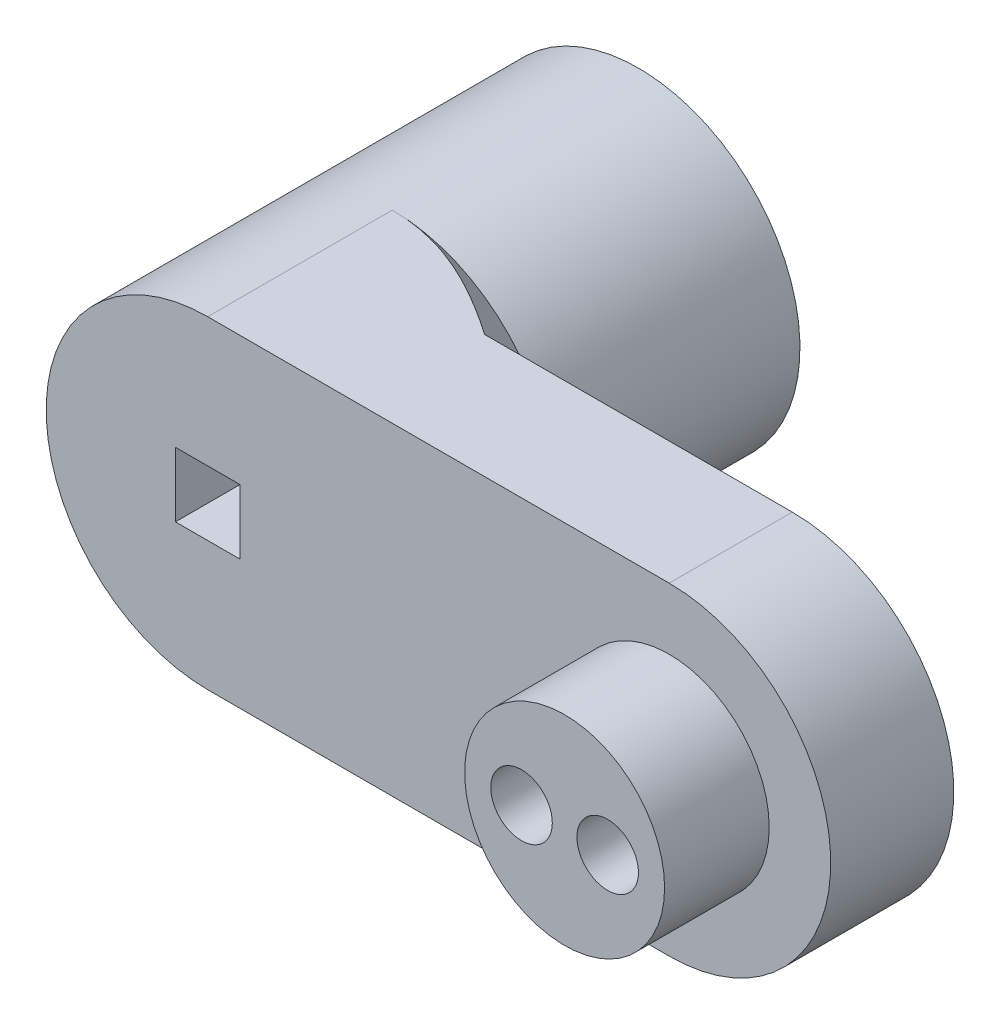
ISO-10303-21;
HEADER;
FILE_DESCRIPTION(('STEP AP214'),'2;1');
FILE_NAME('part.step','',(''),(''),'','','');
FILE_SCHEMA(('AUTOMOTIVE_DESIGN { 1 0 10303 214 1 1 1 1 }'));
ENDSEC;
DATA;
#1=APPLICATION_CONTEXT('core data for automotive mechanical design processes');
#2=APPLICATION_PROTOCOL_DEFINITION('international standard','automotive_design',2000,#1);
#3=PRODUCT_CONTEXT('',#1,'mechanical');
#4=PRODUCT('Part','Part','',(#3));
#5=PRODUCT_RELATED_PRODUCT_CATEGORY('part','',(#4));
#6=PRODUCT_DEFINITION_FORMATION('','',#4);
#7=PRODUCT_DEFINITION_CONTEXT('part definition',#1,'design');
#8=PRODUCT_DEFINITION('design','',#6,#7);
#9=PRODUCT_DEFINITION_SHAPE('','',#8);
#10=(LENGTH_UNIT() NAMED_UNIT(*) SI_UNIT(.MILLI.,.METRE.));
#11=(NAMED_UNIT(*) PLANE_ANGLE_UNIT() SI_UNIT($,.RADIAN.));
#12=(NAMED_UNIT(*) SI_UNIT($,.STERADIAN.) SOLID_ANGLE_UNIT());
#13=UNCERTAINTY_MEASURE_WITH_UNIT(LENGTH_MEASURE(1.E-05),#10,'distance_accuracy_value','');
#14=(GEOMETRIC_REPRESENTATION_CONTEXT(3) GLOBAL_UNCERTAINTY_ASSIGNED_CONTEXT((#13)) GLOBAL_UNIT_ASSIGNED_CONTEXT((#10,
#11,#12)) REPRESENTATION_CONTEXT('',''));
#15=CARTESIAN_POINT('',(0.,0.,0.));
#16=DIRECTION('',(0.,0.,1.));
#17=DIRECTION('',(1.,0.,0.));
#18=AXIS2_PLACEMENT_3D('',#15,#16,#17);
#19=CARTESIAN_POINT('',(0.,0.,-4.));
#20=DIRECTION('',(0.,0.,1.));
#21=DIRECTION('',(1.,0.,0.));
#22=AXIS2_PLACEMENT_3D('',#19,#20,#21);
#23=PLANE('',#22);
#24=CARTESIAN_POINT('',(13.6,0.,-4.));
#25=DIRECTION('',(0.,0.,1.));
#26=DIRECTION('',(1.,0.,0.));
#27=AXIS2_PLACEMENT_3D('',#24,#25,#26);
#28=CIRCLE('',#27,1.);
#29=CARTESIAN_POINT('',(14.6,0.,-4.));
#30=VERTEX_POINT('',#29);
#31=EDGE_CURVE('E153',#30,#30,#28,.T.);
#32=ORIENTED_EDGE('',*,*,#31,.T.);
#33=EDGE_LOOP('',(#32));
#34=FACE_BOUND('',#33,.T.);
#35=CARTESIAN_POINT('',(16.4,0.,-4.));
#36=DIRECTION('',(0.,0.,1.));
#37=DIRECTION('',(1.,0.,0.));
#38=AXIS2_PLACEMENT_3D('',#35,#36,#37);
#39=CIRCLE('',#38,1.);
#40=CARTESIAN_POINT('',(17.4,0.,-4.));
#41=VERTEX_POINT('',#40);
#42=EDGE_CURVE('E244',#41,#41,#39,.T.);
#43=ORIENTED_EDGE('',*,*,#42,.T.);
#44=EDGE_LOOP('',(#43));
#45=FACE_BOUND('',#44,.T.);
#46=DIRECTION('',(1.,0.,0.));
#47=VECTOR('',#46,1.);
#48=CARTESIAN_POINT('',(0.,-5.25,-4.));
#49=LINE('',#48,#47);
#50=CARTESIAN_POINT('',(4.99999999999998,-5.25,-4.));
#51=VERTEX_POINT('',#50);
#52=CARTESIAN_POINT('',(15.,-5.25,-4.));
#53=VERTEX_POINT('',#52);
#54=EDGE_CURVE('E232',#51,#53,#49,.T.);
#55=ORIENTED_EDGE('',*,*,#54,.F.);
#56=CARTESIAN_POINT('',(0.,0.,-4.));
#57=DIRECTION('',(0.,0.,1.));
#58=DIRECTION('',(1.,0.,0.));
#59=AXIS2_PLACEMENT_3D('',#56,#57,#58);
#60=CIRCLE('',#59,7.24999999999999);
#61=CARTESIAN_POINT('',(4.99999999999998,5.25,-4.));
#62=VERTEX_POINT('',#61);
#63=EDGE_CURVE('E295',#51,#62,#60,.T.);
#64=ORIENTED_EDGE('',*,*,#63,.T.);
#65=DIRECTION('',(1.,0.,0.));
#66=VECTOR('',#65,1.);
#67=CARTESIAN_POINT('',(0.,5.25,-4.));
#68=LINE('',#67,#66);
#69=CARTESIAN_POINT('',(15.,5.25,-4.));
#70=VERTEX_POINT('',#69);
#71=EDGE_CURVE('E240',#62,#70,#68,.T.);
#72=ORIENTED_EDGE('',*,*,#71,.T.);
#73=CARTESIAN_POINT('',(15.,0.,-4.));
#74=DIRECTION('',(0.,0.,1.));
#75=DIRECTION('',(1.,0.,0.));
#76=AXIS2_PLACEMENT_3D('',#73,#74,#75);
#77=CIRCLE('',#76,5.25);
#78=EDGE_CURVE('E235',#53,#70,#77,.T.);
#79=ORIENTED_EDGE('',*,*,#78,.F.);
#80=EDGE_LOOP('',(#55,#64,#72,#79));
#81=FACE_BOUND('',#80,.T.);
#82=ADVANCED_FACE('F48',(#34,#45,#81),#23,.F.);
#83=CARTESIAN_POINT('',(13.6,0.,3.4));
#84=DIRECTION('',(0.,0.,-1.));
#85=DIRECTION('',(-1.,0.,0.));
#86=AXIS2_PLACEMENT_3D('',#83,#84,#85);
#87=CYLINDRICAL_SURFACE('',#86,1.);
#88=CARTESIAN_POINT('',(13.6,0.,3.4));
#89=DIRECTION('',(0.,0.,1.));
#90=DIRECTION('',(1.,0.,0.));
#91=AXIS2_PLACEMENT_3D('',#88,#89,#90);
#92=CIRCLE('',#91,1.);
#93=CARTESIAN_POINT('',(14.6,0.,3.4));
#94=VERTEX_POINT('',#93);
#95=EDGE_CURVE('E283',#94,#94,#92,.T.);
#96=ORIENTED_EDGE('',*,*,#95,.T.);
#97=EDGE_LOOP('',(#96));
#98=FACE_BOUND('',#97,.T.);
#99=ORIENTED_EDGE('',*,*,#31,.F.);
#100=EDGE_LOOP('',(#99));
#101=FACE_BOUND('',#100,.T.);
#102=ADVANCED_FACE('F197',(#98,#101),#87,.F.);
#103=CARTESIAN_POINT('',(16.4,0.,3.4));
#104=DIRECTION('',(0.,0.,-1.));
#105=DIRECTION('',(-1.,0.,0.));
#106=AXIS2_PLACEMENT_3D('',#103,#104,#105);
#107=CYLINDRICAL_SURFACE('',#106,1.);
#108=CARTESIAN_POINT('',(16.4,0.,3.4));
#109=DIRECTION('',(0.,0.,1.));
#110=DIRECTION('',(1.,0.,0.));
#111=AXIS2_PLACEMENT_3D('',#108,#109,#110);
#112=CIRCLE('',#111,1.);
#113=CARTESIAN_POINT('',(17.4,0.,3.4));
#114=VERTEX_POINT('',#113);
#115=EDGE_CURVE('E279',#114,#114,#112,.T.);
#116=ORIENTED_EDGE('',*,*,#115,.T.);
#117=EDGE_LOOP('',(#116));
#118=FACE_BOUND('',#117,.T.);
#119=ORIENTED_EDGE('',*,*,#42,.F.);
#120=EDGE_LOOP('',(#119));
#121=FACE_BOUND('',#120,.T.);
#122=ADVANCED_FACE('F180',(#118,#121),#107,.F.);
#123=CARTESIAN_POINT('',(15.,0.,3.4));
#124=DIRECTION('',(0.,0.,-1.));
#125=DIRECTION('',(-1.,0.,0.));
#126=AXIS2_PLACEMENT_3D('',#123,#124,#125);
#127=CYLINDRICAL_SURFACE('',#126,3.25);
#128=CARTESIAN_POINT('',(15.,0.,3.4));
#129=DIRECTION('',(0.,0.,1.));
#130=DIRECTION('',(1.,0.,0.));
#131=AXIS2_PLACEMENT_3D('',#128,#129,#130);
#132=CIRCLE('',#131,3.25);
#133=CARTESIAN_POINT('',(18.25,0.,3.4));
#134=VERTEX_POINT('',#133);
#135=EDGE_CURVE('E287',#134,#134,#132,.T.);
#136=ORIENTED_EDGE('',*,*,#135,.F.);
#137=EDGE_LOOP('',(#136));
#138=FACE_BOUND('',#137,.T.);
#139=CARTESIAN_POINT('',(15.,0.,0.));
#140=DIRECTION('',(0.,0.,1.));
#141=DIRECTION('',(1.,0.,0.));
#142=AXIS2_PLACEMENT_3D('',#139,#140,#141);
#143=CIRCLE('',#142,3.25);
#144=CARTESIAN_POINT('',(18.25,0.,0.));
#145=VERTEX_POINT('',#144);
#146=EDGE_CURVE('E267',#145,#145,#143,.T.);
#147=ORIENTED_EDGE('',*,*,#146,.T.);
#148=EDGE_LOOP('',(#147));
#149=FACE_BOUND('',#148,.T.);
#150=ADVANCED_FACE('F325',(#138,#149),#127,.T.);
#151=CARTESIAN_POINT('',(0.,0.,3.4));
#152=DIRECTION('',(0.,0.,1.));
#153=DIRECTION('',(1.,0.,0.));
#154=AXIS2_PLACEMENT_3D('',#151,#152,#153);
#155=PLANE('',#154);
#156=ORIENTED_EDGE('',*,*,#115,.F.);
#157=EDGE_LOOP('',(#156));
#158=FACE_BOUND('',#157,.T.);
#159=ORIENTED_EDGE('',*,*,#95,.F.);
#160=EDGE_LOOP('',(#159));
#161=FACE_BOUND('',#160,.T.);
#162=ORIENTED_EDGE('',*,*,#135,.T.);
#163=EDGE_LOOP('',(#162));
#164=FACE_BOUND('',#163,.T.);
#165=ADVANCED_FACE('F219',(#158,#161,#164),#155,.T.);
#166=CARTESIAN_POINT('',(0.,-5.25,-4.));
#167=DIRECTION('',(0.,-1.,0.));
#168=DIRECTION('',(1.,0.,0.));
#169=AXIS2_PLACEMENT_3D('',#166,#167,#168);
#170=PLANE('',#169);
#171=DIRECTION('',(1.,0.,0.));
#172=VECTOR('',#171,1.);
#173=CARTESIAN_POINT('',(0.,-5.25,0.));
#174=LINE('',#173,#172);
#175=CARTESIAN_POINT('',(0.,-5.25,0.));
#176=VERTEX_POINT('',#175);
#177=CARTESIAN_POINT('',(15.,-5.25,0.));
#178=VERTEX_POINT('',#177);
#179=EDGE_CURVE('E141',#176,#178,#174,.T.);
#180=ORIENTED_EDGE('',*,*,#179,.F.);
#181=DIRECTION('',(0.,0.,1.));
#182=VECTOR('',#181,1.);
#183=CARTESIAN_POINT('',(0.,-5.25,-4.));
#184=LINE('',#183,#182);
#185=CARTESIAN_POINT('',(0.,-5.25,-6.00000000000001));
#186=VERTEX_POINT('',#185);
#187=EDGE_CURVE('E264',#186,#176,#184,.T.);
#188=ORIENTED_EDGE('',*,*,#187,.F.);
#189=CARTESIAN_POINT('',(0.,-5.25,-6.00000000000001));
#190=CARTESIAN_POINT('',(0.0807366881470872,-5.25,-6.00000650999017));
#191=CARTESIAN_POINT('',(0.161461447589914,-5.25,-5.99813666432243));
#192=CARTESIAN_POINT('',(0.32272801124755,-5.25,-5.99070548186321));
#193=CARTESIAN_POINT('',(0.403269843311232,-5.25,-5.98514475088968));
#194=CARTESIAN_POINT('',(0.644080213218348,-5.25,-5.96304847037836));
#195=CARTESIAN_POINT('',(0.803878242295653,-5.25,-5.94109831008023));
#196=CARTESIAN_POINT('',(1.11826486040596,-5.25,-5.88441677014049));
#197=CARTESIAN_POINT('',(1.27289572339923,-5.25,-5.84991403280655));
#198=CARTESIAN_POINT('',(1.57921300621033,-5.25,-5.7696207121566));
#199=CARTESIAN_POINT('',(1.73089845024517,-5.25,-5.72382645466372));
#200=CARTESIAN_POINT('',(2.15638315254795,-5.25,-5.58032786379069));
#201=CARTESIAN_POINT('',(2.42633296079444,-5.25,-5.47121793223172));
#202=CARTESIAN_POINT('',(2.95595079625327,-5.25,-5.22967288384808));
#203=CARTESIAN_POINT('',(3.21559508246758,-5.25,-5.09718734931142));
#204=CARTESIAN_POINT('',(3.60270017923878,-5.25,-4.88368944181136));
#205=CARTESIAN_POINT('',(3.73352625794627,-5.25,-4.80866307689336));
#206=CARTESIAN_POINT('',(3.99298950946675,-5.25,-4.65488625973031));
#207=CARTESIAN_POINT('',(4.12162649068147,-5.25,-4.57613548376685));
#208=CARTESIAN_POINT('',(4.37622598651679,-5.25,-4.41595955235408));
#209=CARTESIAN_POINT('',(4.50219933606349,-5.25,-4.33455153502657));
#210=CARTESIAN_POINT('',(4.75236969016551,-5.25,-4.16912581176855));
#211=CARTESIAN_POINT('',(4.87656720491074,-5.25,-4.08510887830151));
#212=CARTESIAN_POINT('',(4.99999999999998,-5.25,-4.));
#213=B_SPLINE_CURVE_WITH_KNOTS('',3,(#189,#190,#191,#192,#193,#194,#195,#196,#197,#198,#199,
#200,#201,#202,#203,#204,#205,#206,#207,#208,#209,#210,#211,#212),.UNSPECIFIED.,.F.,.F.,(4,2,2,
2,2,2,2,2,2,2,2,4),(0.,0.242165624093413,0.484291509208345,0.967513328316255,1.44234123501428,
1.91732385155957,2.78911814571654,3.66281628393228,4.1152028806605,4.56762887045825,
5.01756053589968,5.46736022983452),.UNSPECIFIED.);
#214=EDGE_CURVE('E59',#186,#51,#213,.T.);
#215=ORIENTED_EDGE('',*,*,#214,.T.);
#216=ORIENTED_EDGE('',*,*,#54,.T.);
#217=DIRECTION('',(0.,0.,1.));
#218=VECTOR('',#217,1.);
#219=CARTESIAN_POINT('',(15.,-5.25,-4.));
#220=LINE('',#219,#218);
#221=EDGE_CURVE('E150',#53,#178,#220,.T.);
#222=ORIENTED_EDGE('',*,*,#221,.T.);
#223=EDGE_LOOP('',(#180,#188,#215,#216,#222));
#224=FACE_BOUND('',#223,.T.);
#225=ADVANCED_FACE('F212',(#224),#170,.T.);
#226=CARTESIAN_POINT('',(0.,0.,-4.));
#227=DIRECTION('',(0.,0.,1.));
#228=DIRECTION('',(1.,0.,0.));
#229=AXIS2_PLACEMENT_3D('',#226,#227,#228);
#230=CYLINDRICAL_SURFACE('',#229,5.25);
#231=CARTESIAN_POINT('',(0.,0.,-6.00000000000001));
#232=DIRECTION('',(0.,0.,1.));
#233=DIRECTION('',(1.,0.,0.));
#234=AXIS2_PLACEMENT_3D('',#231,#232,#233);
#235=CIRCLE('',#234,5.25);
#236=CARTESIAN_POINT('',(0.,5.25,-6.00000000000001));
#237=VERTEX_POINT('',#236);
#238=EDGE_CURVE('E225',#237,#186,#235,.F.);
#239=ORIENTED_EDGE('',*,*,#238,.T.);
#240=ORIENTED_EDGE('',*,*,#187,.T.);
#241=CARTESIAN_POINT('',(0.,0.,0.));
#242=DIRECTION('',(0.,0.,1.));
#243=DIRECTION('',(1.,0.,0.));
#244=AXIS2_PLACEMENT_3D('',#241,#242,#243);
#245=CIRCLE('',#244,5.25);
#246=CARTESIAN_POINT('',(0.,5.25,0.));
#247=VERTEX_POINT('',#246);
#248=EDGE_CURVE('E236',#247,#176,#245,.T.);
#249=ORIENTED_EDGE('',*,*,#248,.F.);
#250=DIRECTION('',(0.,0.,1.));
#251=VECTOR('',#250,1.);
#252=CARTESIAN_POINT('',(0.,5.25,-4.));
#253=LINE('',#252,#251);
#254=EDGE_CURVE('E268',#237,#247,#253,.T.);
#255=ORIENTED_EDGE('',*,*,#254,.F.);
#256=EDGE_LOOP('',(#239,#240,#249,#255));
#257=FACE_BOUND('',#256,.T.);
#258=CARTESIAN_POINT('',(0.,0.,-14.));
#259=DIRECTION('',(0.,0.,-1.));
#260=DIRECTION('',(-1.,0.,0.));
#261=AXIS2_PLACEMENT_3D('',#258,#259,#260);
#262=CIRCLE('',#261,5.25);
#263=CARTESIAN_POINT('',(-5.25,0.,-14.));
#264=VERTEX_POINT('',#263);
#265=EDGE_CURVE('E129',#264,#264,#262,.T.);
#266=ORIENTED_EDGE('',*,*,#265,.F.);
#267=EDGE_LOOP('',(#266));
#268=FACE_BOUND('',#267,.T.);
#269=ADVANCED_FACE('F210',(#257,#268),#230,.T.);
#270=CARTESIAN_POINT('',(0.,5.25,-4.));
#271=DIRECTION('',(0.,-1.,0.));
#272=DIRECTION('',(1.,0.,0.));
#273=AXIS2_PLACEMENT_3D('',#270,#271,#272);
#274=PLANE('',#273);
#275=DIRECTION('',(1.,0.,0.));
#276=VECTOR('',#275,1.);
#277=CARTESIAN_POINT('',(0.,5.25,0.));
#278=LINE('',#277,#276);
#279=CARTESIAN_POINT('',(15.,5.25,0.));
#280=VERTEX_POINT('',#279);
#281=EDGE_CURVE('E257',#247,#280,#278,.T.);
#282=ORIENTED_EDGE('',*,*,#281,.T.);
#283=DIRECTION('',(0.,0.,1.));
#284=VECTOR('',#283,1.);
#285=CARTESIAN_POINT('',(15.,5.25,-4.));
#286=LINE('',#285,#284);
#287=EDGE_CURVE('E272',#70,#280,#286,.T.);
#288=ORIENTED_EDGE('',*,*,#287,.F.);
#289=ORIENTED_EDGE('',*,*,#71,.F.);
#290=CARTESIAN_POINT('',(4.99999999999998,5.25,-4.));
#291=CARTESIAN_POINT('',(4.84940746348629,5.25,-4.1038161889332));
#292=CARTESIAN_POINT('',(4.69768083679421,5.25,-4.20603299277092));
#293=CARTESIAN_POINT('',(4.39147205897688,5.25,-4.40646542850583));
#294=CARTESIAN_POINT('',(4.23698818842339,5.25,-4.50467842866521));
#295=CARTESIAN_POINT('',(3.92281106878217,5.25,-4.69749009596073));
#296=CARTESIAN_POINT('',(3.76307530526331,5.25,-4.79201987859595));
#297=CARTESIAN_POINT('',(3.44004694431103,5.25,-4.97475703621183));
#298=CARTESIAN_POINT('',(3.27675504654704,5.25,-5.06296564048982));
#299=CARTESIAN_POINT('',(2.95422110229262,5.25,-5.22740640283823));
#300=CARTESIAN_POINT('',(2.79517129830466,5.25,-5.3040132318158));
#301=CARTESIAN_POINT('',(2.47306447718438,5.25,-5.44846327653873));
#302=CARTESIAN_POINT('',(2.31000666119979,5.25,-5.51630472808601));
#303=CARTESIAN_POINT('',(1.9806836570032,5.25,-5.64085512333139));
#304=CARTESIAN_POINT('',(1.81444113059675,5.25,-5.6976234278291));
#305=CARTESIAN_POINT('',(1.47813931096763,5.25,-5.79823708380445));
#306=CARTESIAN_POINT('',(1.30808286685702,5.25,-5.84209175741578));
#307=CARTESIAN_POINT('',(1.04370353072888,5.25,-5.89802988649412));
#308=CARTESIAN_POINT('',(0.950492700320168,5.25,-5.91545210823447));
#309=CARTESIAN_POINT('',(0.763267556520668,5.25,-5.94561118654793));
#310=CARTESIAN_POINT('',(0.669252925211836,5.25,-5.95834609229011));
#311=CARTESIAN_POINT('',(0.479508673134759,5.25,-5.97900025449719));
#312=CARTESIAN_POINT('',(0.383772274797822,5.25,-5.98685756950462));
#313=CARTESIAN_POINT('',(0.192026209831424,5.25,-5.9973664768988));
#314=CARTESIAN_POINT('',(0.0960165754758754,5.25,-6.00001866046886));
#315=CARTESIAN_POINT('',(0.,5.25,-6.00000000000001));
#316=B_SPLINE_CURVE_WITH_KNOTS('',3,(#290,#291,#292,#293,#294,#295,#296,#297,#298,#299,#300,
#301,#302,#303,#304,#305,#306,#307,#308,#309,#310,#311,#312,#313,#314,#315),.UNSPECIFIED.,.F.,
.F.,(4,2,2,2,2,2,2,2,2,2,2,2,4),(0.,0.548756995366234,1.09786906182333,1.65458516236015,
2.21119270128009,2.7405907714297,3.27009522752533,3.79667801674415,4.32287973749728,
4.60725343491617,4.89174535337549,5.1797798991228,5.46778172887112),.UNSPECIFIED.);
#317=EDGE_CURVE('E12',#62,#237,#316,.T.);
#318=ORIENTED_EDGE('',*,*,#317,.T.);
#319=ORIENTED_EDGE('',*,*,#254,.T.);
#320=EDGE_LOOP('',(#282,#288,#289,#318,#319));
#321=FACE_BOUND('',#320,.T.);
#322=ADVANCED_FACE('F167',(#321),#274,.F.);
#323=CARTESIAN_POINT('',(1.05,0.,-4.));
#324=DIRECTION('',(1.,0.,0.));
#325=DIRECTION('',(0.,0.,-1.));
#326=AXIS2_PLACEMENT_3D('',#323,#324,#325);
#327=PLANE('',#326);
#328=DIRECTION('',(0.,1.,0.));
#329=VECTOR('',#328,1.);
#330=CARTESIAN_POINT('',(1.05,0.,0.));
#331=LINE('',#330,#329);
#332=CARTESIAN_POINT('',(1.05,-1.05,0.));
#333=VERTEX_POINT('',#332);
#334=CARTESIAN_POINT('',(1.05,1.05,0.));
#335=VERTEX_POINT('',#334);
#336=EDGE_CURVE('E132',#333,#335,#331,.T.);
#337=ORIENTED_EDGE('',*,*,#336,.T.);
#338=DIRECTION('',(0.,0.,1.));
#339=VECTOR('',#338,1.);
#340=CARTESIAN_POINT('',(1.05,1.05,-4.));
#341=LINE('',#340,#339);
#342=CARTESIAN_POINT('',(1.05,1.05,-14.));
#343=VERTEX_POINT('',#342);
#344=EDGE_CURVE('E148',#343,#335,#341,.T.);
#345=ORIENTED_EDGE('',*,*,#344,.F.);
#346=DIRECTION('',(0.,-1.,0.));
#347=VECTOR('',#346,1.);
#348=CARTESIAN_POINT('',(1.05,0.,-14.));
#349=LINE('',#348,#347);
#350=CARTESIAN_POINT('',(1.05,-1.05,-14.));
#351=VERTEX_POINT('',#350);
#352=EDGE_CURVE('E127',#343,#351,#349,.T.);
#353=ORIENTED_EDGE('',*,*,#352,.T.);
#354=DIRECTION('',(0.,0.,1.));
#355=VECTOR('',#354,1.);
#356=CARTESIAN_POINT('',(1.05,-1.05,-4.));
#357=LINE('',#356,#355);
#358=EDGE_CURVE('E112',#351,#333,#357,.T.);
#359=ORIENTED_EDGE('',*,*,#358,.T.);
#360=EDGE_LOOP('',(#337,#345,#353,#359));
#361=FACE_BOUND('',#360,.T.);
#362=ADVANCED_FACE('F187',(#361),#327,.F.);
#363=CARTESIAN_POINT('',(0.,1.05,-4.));
#364=DIRECTION('',(0.,-1.,0.));
#365=DIRECTION('',(0.,0.,-1.));
#366=AXIS2_PLACEMENT_3D('',#363,#364,#365);
#367=PLANE('',#366);
#368=DIRECTION('',(1.,0.,0.));
#369=VECTOR('',#368,1.);
#370=CARTESIAN_POINT('',(0.,1.05,0.));
#371=LINE('',#370,#369);
#372=CARTESIAN_POINT('',(-1.05,1.05,0.));
#373=VERTEX_POINT('',#372);
#374=EDGE_CURVE('E137',#373,#335,#371,.T.);
#375=ORIENTED_EDGE('',*,*,#374,.F.);
#376=DIRECTION('',(0.,0.,1.));
#377=VECTOR('',#376,1.);
#378=CARTESIAN_POINT('',(-1.05,1.05,-4.));
#379=LINE('',#378,#377);
#380=CARTESIAN_POINT('',(-1.05,1.05,-14.));
#381=VERTEX_POINT('',#380);
#382=EDGE_CURVE('E97',#381,#373,#379,.T.);
#383=ORIENTED_EDGE('',*,*,#382,.F.);
#384=DIRECTION('',(1.,0.,0.));
#385=VECTOR('',#384,1.);
#386=CARTESIAN_POINT('',(0.,1.05,-14.));
#387=LINE('',#386,#385);
#388=EDGE_CURVE('E124',#381,#343,#387,.T.);
#389=ORIENTED_EDGE('',*,*,#388,.T.);
#390=ORIENTED_EDGE('',*,*,#344,.T.);
#391=EDGE_LOOP('',(#375,#383,#389,#390));
#392=FACE_BOUND('',#391,.T.);
#393=ADVANCED_FACE('F50',(#392),#367,.T.);
#394=CARTESIAN_POINT('',(-1.05,0.,-4.));
#395=DIRECTION('',(1.,0.,0.));
#396=DIRECTION('',(0.,0.,-1.));
#397=AXIS2_PLACEMENT_3D('',#394,#395,#396);
#398=PLANE('',#397);
#399=DIRECTION('',(0.,1.,0.));
#400=VECTOR('',#399,1.);
#401=CARTESIAN_POINT('',(-1.05,0.,0.));
#402=LINE('',#401,#400);
#403=CARTESIAN_POINT('',(-1.05,-1.05,0.));
#404=VERTEX_POINT('',#403);
#405=EDGE_CURVE('E108',#404,#373,#402,.T.);
#406=ORIENTED_EDGE('',*,*,#405,.F.);
#407=DIRECTION('',(0.,0.,1.));
#408=VECTOR('',#407,1.);
#409=CARTESIAN_POINT('',(-1.05,-1.05,-4.));
#410=LINE('',#409,#408);
#411=CARTESIAN_POINT('',(-1.05,-1.05,-14.));
#412=VERTEX_POINT('',#411);
#413=EDGE_CURVE('E102',#412,#404,#410,.T.);
#414=ORIENTED_EDGE('',*,*,#413,.F.);
#415=DIRECTION('',(0.,1.,0.));
#416=VECTOR('',#415,1.);
#417=CARTESIAN_POINT('',(-1.05,0.,-14.));
#418=LINE('',#417,#416);
#419=EDGE_CURVE('E52',#412,#381,#418,.T.);
#420=ORIENTED_EDGE('',*,*,#419,.T.);
#421=ORIENTED_EDGE('',*,*,#382,.T.);
#422=EDGE_LOOP('',(#406,#414,#420,#421));
#423=FACE_BOUND('',#422,.T.);
#424=ADVANCED_FACE('F104',(#423),#398,.T.);
#425=CARTESIAN_POINT('',(15.,0.,-4.));
#426=DIRECTION('',(0.,0.,1.));
#427=DIRECTION('',(1.,0.,0.));
#428=AXIS2_PLACEMENT_3D('',#425,#426,#427);
#429=CYLINDRICAL_SURFACE('',#428,5.25);
#430=CARTESIAN_POINT('',(15.,0.,0.));
#431=DIRECTION('',(0.,0.,1.));
#432=DIRECTION('',(1.,0.,0.));
#433=AXIS2_PLACEMENT_3D('',#430,#431,#432);
#434=CIRCLE('',#433,5.25);
#435=EDGE_CURVE('E253',#178,#280,#434,.T.);
#436=ORIENTED_EDGE('',*,*,#435,.F.);
#437=ORIENTED_EDGE('',*,*,#221,.F.);
#438=ORIENTED_EDGE('',*,*,#78,.T.);
#439=ORIENTED_EDGE('',*,*,#287,.T.);
#440=EDGE_LOOP('',(#436,#437,#438,#439));
#441=FACE_BOUND('',#440,.T.);
#442=ADVANCED_FACE('F186',(#441),#429,.T.);
#443=CARTESIAN_POINT('',(0.,-1.05,-4.));
#444=DIRECTION('',(0.,-1.,0.));
#445=DIRECTION('',(0.,0.,-1.));
#446=AXIS2_PLACEMENT_3D('',#443,#444,#445);
#447=PLANE('',#446);
#448=DIRECTION('',(1.,0.,0.));
#449=VECTOR('',#448,1.);
#450=CARTESIAN_POINT('',(0.,-1.05,0.));
#451=LINE('',#450,#449);
#452=EDGE_CURVE('E136',#404,#333,#451,.T.);
#453=ORIENTED_EDGE('',*,*,#452,.T.);
#454=ORIENTED_EDGE('',*,*,#358,.F.);
#455=DIRECTION('',(-1.,0.,0.));
#456=VECTOR('',#455,1.);
#457=CARTESIAN_POINT('',(0.,-1.05,-14.));
#458=LINE('',#457,#456);
#459=EDGE_CURVE('E115',#351,#412,#458,.T.);
#460=ORIENTED_EDGE('',*,*,#459,.T.);
#461=ORIENTED_EDGE('',*,*,#413,.T.);
#462=EDGE_LOOP('',(#453,#454,#460,#461));
#463=FACE_BOUND('',#462,.T.);
#464=ADVANCED_FACE('F116',(#463),#447,.F.);
#465=CARTESIAN_POINT('',(0.,0.,0.));
#466=DIRECTION('',(0.,0.,1.));
#467=DIRECTION('',(1.,0.,0.));
#468=AXIS2_PLACEMENT_3D('',#465,#466,#467);
#469=PLANE('',#468);
#470=ORIENTED_EDGE('',*,*,#146,.F.);
#471=EDGE_LOOP('',(#470));
#472=FACE_BOUND('',#471,.T.);
#473=ORIENTED_EDGE('',*,*,#336,.F.);
#474=ORIENTED_EDGE('',*,*,#452,.F.);
#475=ORIENTED_EDGE('',*,*,#405,.T.);
#476=ORIENTED_EDGE('',*,*,#374,.T.);
#477=EDGE_LOOP('',(#473,#474,#475,#476));
#478=FACE_BOUND('',#477,.T.);
#479=ORIENTED_EDGE('',*,*,#179,.T.);
#480=ORIENTED_EDGE('',*,*,#435,.T.);
#481=ORIENTED_EDGE('',*,*,#281,.F.);
#482=ORIENTED_EDGE('',*,*,#248,.T.);
#483=EDGE_LOOP('',(#479,#480,#481,#482));
#484=FACE_BOUND('',#483,.T.);
#485=ADVANCED_FACE('F185',(#472,#478,#484),#469,.T.);
#486=CARTESIAN_POINT('',(0.,0.,-14.));
#487=DIRECTION('',(0.,0.,-1.));
#488=DIRECTION('',(-1.,0.,0.));
#489=AXIS2_PLACEMENT_3D('',#486,#487,#488);
#490=PLANE('',#489);
#491=ORIENTED_EDGE('',*,*,#265,.T.);
#492=EDGE_LOOP('',(#491));
#493=FACE_BOUND('',#492,.T.);
#494=ORIENTED_EDGE('',*,*,#419,.F.);
#495=ORIENTED_EDGE('',*,*,#459,.F.);
#496=ORIENTED_EDGE('',*,*,#352,.F.);
#497=ORIENTED_EDGE('',*,*,#388,.F.);
#498=EDGE_LOOP('',(#494,#495,#496,#497));
#499=FACE_BOUND('',#498,.T.);
#500=ADVANCED_FACE('F123',(#493,#499),#490,.T.);
#501=CARTESIAN_POINT('',(0.,0.,-6.00000000000001));
#502=DIRECTION('',(0.,0.,1.));
#503=DIRECTION('',(1.,0.,0.));
#504=AXIS2_PLACEMENT_3D('',#501,#502,#503);
#505=CONICAL_SURFACE('',#504,5.25,0.785398163397443);
#506=ORIENTED_EDGE('',*,*,#317,.F.);
#507=ORIENTED_EDGE('',*,*,#63,.F.);
#508=ORIENTED_EDGE('',*,*,#214,.F.);
#509=ORIENTED_EDGE('',*,*,#238,.F.);
#510=EDGE_LOOP('',(#506,#507,#508,#509));
#511=FACE_BOUND('',#510,.T.);
#512=ADVANCED_FACE('F172',(#511),#505,.T.);
#513=CLOSED_SHELL('',(#82,#102,#122,#150,#165,#225,#269,#322,#362,#393,#424,#442,#464,#485,#500,#512));
#514=MANIFOLD_SOLID_BREP('B2',#513);
#515=ADVANCED_BREP_SHAPE_REPRESENTATION('',(#18,#514),#14);
#516=SHAPE_DEFINITION_REPRESENTATION(#9,#515);
ENDSEC;
END-ISO-10303-21;
